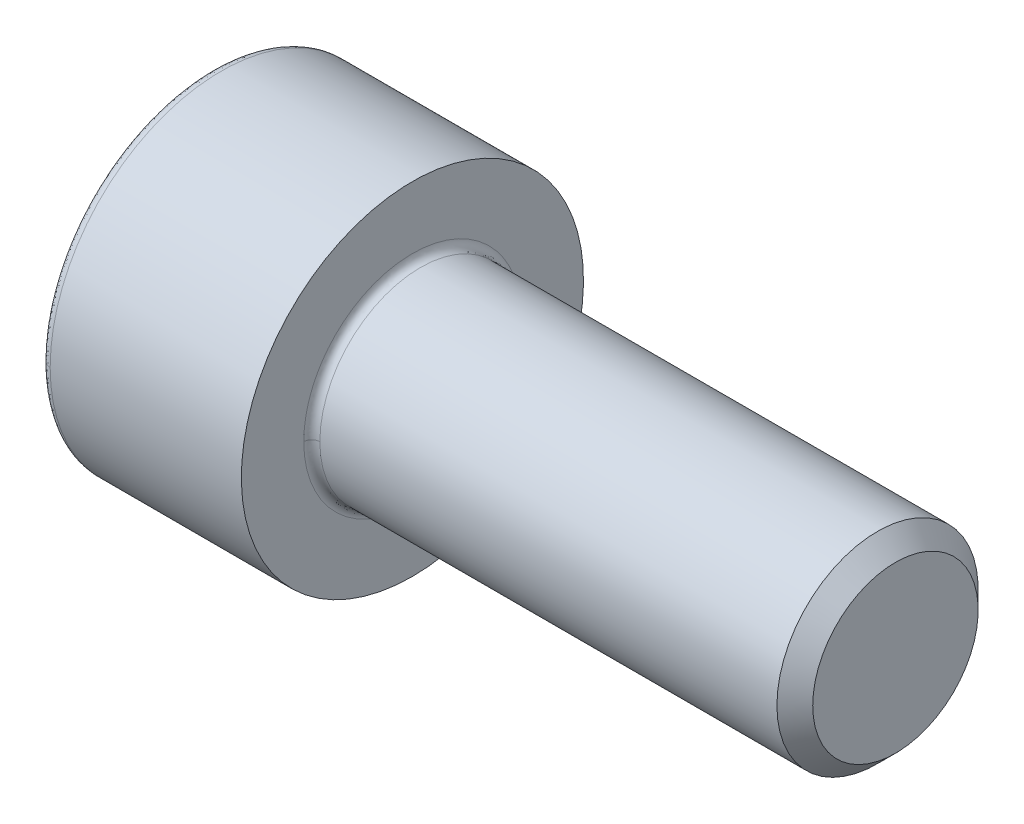
ISO-10303-21;
HEADER;
FILE_DESCRIPTION(('STEP AP214'),'2;1');
FILE_NAME('part.step','',(''),(''),'','','');
FILE_SCHEMA(('AUTOMOTIVE_DESIGN { 1 0 10303 214 1 1 1 1 }'));
ENDSEC;
DATA;
#1=APPLICATION_CONTEXT('core data for automotive mechanical design processes');
#2=APPLICATION_PROTOCOL_DEFINITION('international standard','automotive_design',2000,#1);
#3=PRODUCT_CONTEXT('',#1,'mechanical');
#4=PRODUCT('Part','Part','',(#3));
#5=PRODUCT_RELATED_PRODUCT_CATEGORY('part','',(#4));
#6=PRODUCT_DEFINITION_FORMATION('','',#4);
#7=PRODUCT_DEFINITION_CONTEXT('part definition',#1,'design');
#8=PRODUCT_DEFINITION('design','',#6,#7);
#9=PRODUCT_DEFINITION_SHAPE('','',#8);
#10=(LENGTH_UNIT() NAMED_UNIT(*) SI_UNIT(.MILLI.,.METRE.));
#11=(NAMED_UNIT(*) PLANE_ANGLE_UNIT() SI_UNIT($,.RADIAN.));
#12=(NAMED_UNIT(*) SI_UNIT($,.STERADIAN.) SOLID_ANGLE_UNIT());
#13=UNCERTAINTY_MEASURE_WITH_UNIT(LENGTH_MEASURE(1.E-05),#10,'distance_accuracy_value','');
#14=(GEOMETRIC_REPRESENTATION_CONTEXT(3) GLOBAL_UNCERTAINTY_ASSIGNED_CONTEXT((#13)) GLOBAL_UNIT_ASSIGNED_CONTEXT((#10,
#11,#12)) REPRESENTATION_CONTEXT('',''));
#15=CARTESIAN_POINT('',(0.,0.,0.));
#16=DIRECTION('',(0.,0.,1.));
#17=DIRECTION('',(1.,0.,0.));
#18=AXIS2_PLACEMENT_3D('',#15,#16,#17);
#19=CARTESIAN_POINT('',(17.,-2.07966,2.07966));
#20=DIRECTION('',(1.,0.,0.));
#21=DIRECTION('',(0.,0.,-1.));
#22=AXIS2_PLACEMENT_3D('',#19,#20,#21);
#23=PLANE('',#22);
#24=CARTESIAN_POINT('',(16.9999999999999,0.,0.));
#25=DIRECTION('',(-1.,0.,0.));
#26=DIRECTION('',(0.,0.,1.));
#27=AXIS2_PLACEMENT_3D('',#24,#25,#26);
#28=CIRCLE('',#27,2.0550000000001);
#29=CARTESIAN_POINT('',(16.9999999999999,0.,2.0550000000001));
#30=VERTEX_POINT('',#29);
#31=EDGE_CURVE('E20',#30,#30,#28,.F.);
#32=ORIENTED_EDGE('',*,*,#31,.T.);
#33=EDGE_LOOP('',(#32));
#34=FACE_BOUND('',#33,.T.);
#35=ADVANCED_FACE('F16',(#34),#23,.T.);
#36=CARTESIAN_POINT('',(17.,0.,0.));
#37=DIRECTION('',(-1.,0.,0.));
#38=DIRECTION('',(0.,0.,1.));
#39=AXIS2_PLACEMENT_3D('',#36,#37,#38);
#40=CONICAL_SURFACE('',#39,2.055,0.785398163397447);
#41=CARTESIAN_POINT('',(16.555,0.,0.));
#42=DIRECTION('',(-1.,0.,0.));
#43=DIRECTION('',(0.,0.,1.));
#44=AXIS2_PLACEMENT_3D('',#41,#42,#43);
#45=CIRCLE('',#44,2.5);
#46=CARTESIAN_POINT('',(16.555,0.,2.5));
#47=VERTEX_POINT('',#46);
#48=EDGE_CURVE('E350',#47,#47,#45,.F.);
#49=ORIENTED_EDGE('',*,*,#48,.T.);
#50=EDGE_LOOP('',(#49));
#51=FACE_BOUND('',#50,.T.);
#52=ORIENTED_EDGE('',*,*,#31,.F.);
#53=EDGE_LOOP('',(#52));
#54=FACE_BOUND('',#53,.T.);
#55=ADVANCED_FACE('F439',(#51,#54),#40,.T.);
#56=CARTESIAN_POINT('',(16.555,0.,0.));
#57=DIRECTION('',(-1.,0.,0.));
#58=DIRECTION('',(0.,0.,1.));
#59=AXIS2_PLACEMENT_3D('',#56,#57,#58);
#60=CYLINDRICAL_SURFACE('',#59,2.5);
#61=CARTESIAN_POINT('',(5.19999999962598,0.,0.));
#62=DIRECTION('',(1.,0.,0.));
#63=DIRECTION('',(0.,1.,0.));
#64=AXIS2_PLACEMENT_3D('',#61,#62,#63);
#65=CIRCLE('',#64,2.49999999998839);
#66=CARTESIAN_POINT('',(5.19999999962598,-2.56379285644164E-10,-2.4999999999913));
#67=VERTEX_POINT('',#66);
#68=CARTESIAN_POINT('',(5.19999999971949,0.,2.4999999999913));
#69=VERTEX_POINT('',#68);
#70=EDGE_CURVE('E353',#67,#69,#65,.T.);
#71=ORIENTED_EDGE('',*,*,#70,.T.);
#72=CARTESIAN_POINT('',(5.19999999962598,0.,0.));
#73=DIRECTION('',(1.,0.,0.));
#74=DIRECTION('',(0.,1.,0.));
#75=AXIS2_PLACEMENT_3D('',#72,#73,#74);
#76=CIRCLE('',#75,2.49999999998839);
#77=EDGE_CURVE('E342',#69,#67,#76,.T.);
#78=ORIENTED_EDGE('',*,*,#77,.T.);
#79=EDGE_LOOP('',(#71,#78));
#80=FACE_BOUND('',#79,.T.);
#81=ORIENTED_EDGE('',*,*,#48,.F.);
#82=EDGE_LOOP('',(#81));
#83=FACE_BOUND('',#82,.T.);
#84=ADVANCED_FACE('F327',(#80,#83),#60,.T.);
#85=CARTESIAN_POINT('',(5.000999167,0.,2.719966683));
#86=CARTESIAN_POINT('',(5.000999167,-5.439933367,2.719966683));
#87=CARTESIAN_POINT('',(5.000999167,-5.439933367,-2.719966683));
#88=CARTESIAN_POINT('',(5.000999167,0.,-2.719966683));
#89=CARTESIAN_POINT('',(4.987355915,0.,2.583989247));
#90=CARTESIAN_POINT('',(4.987355915,-5.167978494,2.583989247));
#91=CARTESIAN_POINT('',(4.987355915,-5.167978494,-2.583989247));
#92=CARTESIAN_POINT('',(4.987355915,0.,-2.583989247));
#93=CARTESIAN_POINT('',(5.083989247,0.,2.487355915));
#94=CARTESIAN_POINT('',(5.083989247,-4.974711831,2.487355915));
#95=CARTESIAN_POINT('',(5.083989247,-4.974711831,-2.487355915));
#96=CARTESIAN_POINT('',(5.083989247,0.,-2.487355915));
#97=CARTESIAN_POINT('',(5.219966683,0.,2.500999167));
#98=CARTESIAN_POINT('',(5.219966683,-5.001998334,2.500999167));
#99=CARTESIAN_POINT('',(5.219966683,-5.001998334,-2.500999167));
#100=CARTESIAN_POINT('',(5.219966683,0.,-2.500999167));
#101=(BOUNDED_SURFACE() B_SPLINE_SURFACE(3,3,((#85,#86,#87,#88),(#89,#90,#91,#92),(#93,#94,#95,
#96),(#97,#98,#99,#100)),.UNSPECIFIED.,.F.,.F.,.F.) B_SPLINE_SURFACE_WITH_KNOTS((4,4),(4,4),(0.,
1.),(0.,1.),.UNSPECIFIED.) GEOMETRIC_REPRESENTATION_ITEM() RATIONAL_B_SPLINE_SURFACE(((1.,
0.333333333333333,0.333333333333333,1.),(0.755320871117972,0.251773623705991,0.251773623705991,
0.755320871117972),(0.755320871117972,0.251773623705991,0.251773623705991,0.755320871117972),
(1.,0.333333333333333,0.333333333333333,1.))) REPRESENTATION_ITEM('') SURFACE());
#102=CARTESIAN_POINT('',(5.000999167,0.,2.719966683));
#103=CARTESIAN_POINT('',(4.987355915,0.,2.583989247));
#104=CARTESIAN_POINT('',(5.083989247,0.,2.487355915));
#105=CARTESIAN_POINT('',(5.219966683,0.,2.500999167));
#106=(BOUNDED_CURVE() B_SPLINE_CURVE(3,(#102,#103,#104,#105),.UNSPECIFIED.,.F.,
.F.) B_SPLINE_CURVE_WITH_KNOTS((4,4),(0.,1.),
.UNSPECIFIED.) CURVE() GEOMETRIC_REPRESENTATION_ITEM() RATIONAL_B_SPLINE_CURVE((1.,
0.755320871117972,0.755320871117972,1.)) REPRESENTATION_ITEM(''));
#107=CARTESIAN_POINT('',(4.99999999999304,0.,2.70000000000253));
#108=VERTEX_POINT('',#107);
#109=EDGE_CURVE('E302',#69,#108,#106,.F.);
#110=CARTESIAN_POINT('',(4.99999999998839,0.,2.69999999940735));
#111=CARTESIAN_POINT('',(4.99999999998839,-5.39999999968315,2.69999999940735));
#112=CARTESIAN_POINT('',(4.99999999998839,-5.39999999968315,-2.69999999940735));
#113=CARTESIAN_POINT('',(4.99999999998839,0.,-2.69999999940735));
#114=(BOUNDED_CURVE() B_SPLINE_CURVE(3,(#110,#111,#112,#113),.UNSPECIFIED.,.F.,
.F.) B_SPLINE_CURVE_WITH_KNOTS((4,4),(0.,1.),
.UNSPECIFIED.) CURVE() GEOMETRIC_REPRESENTATION_ITEM() RATIONAL_B_SPLINE_CURVE((0.956578301732848,
0.318859433910949,0.318859433910949,0.956578301732848)) REPRESENTATION_ITEM(''));
#115=CARTESIAN_POINT('',(4.99999999999304,0.,-2.70000000000254));
#116=VERTEX_POINT('',#115);
#117=EDGE_CURVE('E362',#116,#108,#114,.F.);
#118=CARTESIAN_POINT('',(5.000999167,0.,-2.719966683));
#119=CARTESIAN_POINT('',(4.987355915,0.,-2.583989247));
#120=CARTESIAN_POINT('',(5.083989247,0.,-2.487355915));
#121=CARTESIAN_POINT('',(5.219966683,0.,-2.500999167));
#122=(BOUNDED_CURVE() B_SPLINE_CURVE(3,(#118,#119,#120,#121),.UNSPECIFIED.,.F.,
.F.) B_SPLINE_CURVE_WITH_KNOTS((4,4),(0.,1.),
.UNSPECIFIED.) CURVE() GEOMETRIC_REPRESENTATION_ITEM() RATIONAL_B_SPLINE_CURVE((1.,
0.755320871117972,0.755320871117972,1.)) REPRESENTATION_ITEM(''));
#123=EDGE_CURVE('E349',#116,#67,#122,.T.);
#124=ORIENTED_EDGE('',*,*,#109,.T.);
#125=ORIENTED_EDGE('',*,*,#117,.F.);
#126=ORIENTED_EDGE('',*,*,#123,.T.);
#127=ORIENTED_EDGE('',*,*,#77,.F.);
#128=EDGE_LOOP('',(#124,#125,#126,#127));
#129=FACE_BOUND('',#128,.T.);
#130=ADVANCED_FACE('F316',(#129),#101,.F.);
#131=CARTESIAN_POINT('',(5.000999167,0.,-2.719966683));
#132=CARTESIAN_POINT('',(5.000999167,5.439933367,-2.719966683));
#133=CARTESIAN_POINT('',(5.000999167,5.439933367,2.719966683));
#134=CARTESIAN_POINT('',(5.000999167,0.,2.719966683));
#135=CARTESIAN_POINT('',(4.987355915,0.,-2.583989247));
#136=CARTESIAN_POINT('',(4.987355915,5.167978494,-2.583989247));
#137=CARTESIAN_POINT('',(4.987355915,5.167978494,2.583989247));
#138=CARTESIAN_POINT('',(4.987355915,0.,2.583989247));
#139=CARTESIAN_POINT('',(5.083989247,0.,-2.487355915));
#140=CARTESIAN_POINT('',(5.083989247,4.974711831,-2.487355915));
#141=CARTESIAN_POINT('',(5.083989247,4.974711831,2.487355915));
#142=CARTESIAN_POINT('',(5.083989247,0.,2.487355915));
#143=CARTESIAN_POINT('',(5.219966683,0.,-2.500999167));
#144=CARTESIAN_POINT('',(5.219966683,5.001998334,-2.500999167));
#145=CARTESIAN_POINT('',(5.219966683,5.001998334,2.500999167));
#146=CARTESIAN_POINT('',(5.219966683,0.,2.500999167));
#147=(BOUNDED_SURFACE() B_SPLINE_SURFACE(3,3,((#131,#132,#133,#134),(#135,#136,#137,#138),(#139,
#140,#141,#142),(#143,#144,#145,#146)),.UNSPECIFIED.,.F.,.F.,
.F.) B_SPLINE_SURFACE_WITH_KNOTS((4,4),(4,4),(0.,1.),(0.,1.),
.UNSPECIFIED.) GEOMETRIC_REPRESENTATION_ITEM() RATIONAL_B_SPLINE_SURFACE(((1.,0.333333333333333,
0.333333333333333,1.),(0.755320871117972,0.251773623705991,0.251773623705991,0.755320871117972),
(0.755320871117972,0.251773623705991,0.251773623705991,0.755320871117972),(1.,0.333333333333333,
0.333333333333333,1.))) REPRESENTATION_ITEM('') SURFACE());
#148=CARTESIAN_POINT('',(4.99999999998839,0.,-2.69999999940735));
#149=CARTESIAN_POINT('',(4.99999999998839,5.39999999968315,-2.69999999940735));
#150=CARTESIAN_POINT('',(4.99999999998839,5.39999999968315,2.69999999940735));
#151=CARTESIAN_POINT('',(4.99999999998839,0.,2.69999999940735));
#152=(BOUNDED_CURVE() B_SPLINE_CURVE(3,(#148,#149,#150,#151),.UNSPECIFIED.,.F.,
.F.) B_SPLINE_CURVE_WITH_KNOTS((4,4),(0.,1.),
.UNSPECIFIED.) CURVE() GEOMETRIC_REPRESENTATION_ITEM() RATIONAL_B_SPLINE_CURVE((0.956578301732847,
0.318859433910949,0.318859433910949,0.956578301732847)) REPRESENTATION_ITEM(''));
#153=EDGE_CURVE('E298',#108,#116,#152,.F.);
#154=ORIENTED_EDGE('',*,*,#70,.F.);
#155=ORIENTED_EDGE('',*,*,#123,.F.);
#156=ORIENTED_EDGE('',*,*,#153,.F.);
#157=ORIENTED_EDGE('',*,*,#109,.F.);
#158=EDGE_LOOP('',(#154,#155,#156,#157));
#159=FACE_BOUND('',#158,.T.);
#160=ADVANCED_FACE('F304',(#159),#147,.F.);
#161=CARTESIAN_POINT('',(5.,-4.301,4.301));
#162=DIRECTION('',(1.,0.,0.));
#163=DIRECTION('',(0.,0.,-1.));
#164=AXIS2_PLACEMENT_3D('',#161,#162,#163);
#165=PLANE('',#164);
#166=ORIENTED_EDGE('',*,*,#117,.T.);
#167=ORIENTED_EDGE('',*,*,#153,.T.);
#168=EDGE_LOOP('',(#166,#167));
#169=FACE_BOUND('',#168,.T.);
#170=CARTESIAN_POINT('',(5.,0.,0.));
#171=DIRECTION('',(-1.,0.,0.));
#172=DIRECTION('',(0.,-1.,0.));
#173=AXIS2_PLACEMENT_3D('',#170,#171,#172);
#174=CIRCLE('',#173,4.25);
#175=CARTESIAN_POINT('',(5.,-4.25,0.));
#176=VERTEX_POINT('',#175);
#177=EDGE_CURVE('E286',#176,#176,#174,.F.);
#178=ORIENTED_EDGE('',*,*,#177,.T.);
#179=EDGE_LOOP('',(#178));
#180=FACE_BOUND('',#179,.T.);
#181=ADVANCED_FACE('F315',(#169,#180),#165,.T.);
#182=CARTESIAN_POINT('',(5.,0.,0.));
#183=DIRECTION('',(-1.,0.,0.));
#184=DIRECTION('',(0.,-1.,0.));
#185=AXIS2_PLACEMENT_3D('',#182,#183,#184);
#186=CYLINDRICAL_SURFACE('',#185,4.25);
#187=ORIENTED_EDGE('',*,*,#177,.F.);
#188=EDGE_LOOP('',(#187));
#189=FACE_BOUND('',#188,.T.);
#190=CARTESIAN_POINT('',(0.249999999782476,0.,0.));
#191=DIRECTION('',(-1.,0.,0.));
#192=DIRECTION('',(0.,-1.,0.));
#193=AXIS2_PLACEMENT_3D('',#190,#191,#192);
#194=CIRCLE('',#193,4.24999999976451);
#195=CARTESIAN_POINT('',(0.249999999836857,-1.90811460411058E-10,4.24999999982338));
#196=VERTEX_POINT('',#195);
#197=CARTESIAN_POINT('',(0.249999999782476,-4.35844785595079E-10,-4.24999999982338));
#198=VERTEX_POINT('',#197);
#199=EDGE_CURVE('E283',#196,#198,#194,.T.);
#200=ORIENTED_EDGE('',*,*,#199,.F.);
#201=CARTESIAN_POINT('',(0.249999999782476,0.,0.));
#202=DIRECTION('',(-1.,0.,0.));
#203=DIRECTION('',(0.,-1.,0.));
#204=AXIS2_PLACEMENT_3D('',#201,#202,#203);
#205=CIRCLE('',#204,4.24999999976451);
#206=EDGE_CURVE('E289',#198,#196,#205,.T.);
#207=ORIENTED_EDGE('',*,*,#206,.F.);
#208=EDGE_LOOP('',(#200,#207));
#209=FACE_BOUND('',#208,.T.);
#210=ADVANCED_FACE('F230',(#189,#209),#186,.T.);
#211=CARTESIAN_POINT('',(0.001248959,0.,3.975041646));
#212=CARTESIAN_POINT('',(0.001248959,7.950083292,3.975041646));
#213=CARTESIAN_POINT('',(0.001248959,7.950083292,-3.975041646));
#214=CARTESIAN_POINT('',(0.001248959,0.,-3.975041646));
#215=CARTESIAN_POINT('',(-0.015805106,0.,4.145013441));
#216=CARTESIAN_POINT('',(-0.015805106,8.290026883,4.145013441));
#217=CARTESIAN_POINT('',(-0.015805106,8.290026883,-4.145013441));
#218=CARTESIAN_POINT('',(-0.015805106,0.,-4.145013441));
#219=CARTESIAN_POINT('',(0.104986559,0.,4.265805106));
#220=CARTESIAN_POINT('',(0.104986559,8.531610211,4.265805106));
#221=CARTESIAN_POINT('',(0.104986559,8.531610211,-4.265805106));
#222=CARTESIAN_POINT('',(0.104986559,0.,-4.265805106));
#223=CARTESIAN_POINT('',(0.274958354,0.,4.248751041));
#224=CARTESIAN_POINT('',(0.274958354,8.497502083,4.248751041));
#225=CARTESIAN_POINT('',(0.274958354,8.497502083,-4.248751041));
#226=CARTESIAN_POINT('',(0.274958354,0.,-4.248751041));
#227=(BOUNDED_SURFACE() B_SPLINE_SURFACE(3,3,((#211,#212,#213,#214),(#215,#216,#217,#218),(#219,
#220,#221,#222),(#223,#224,#225,#226)),.UNSPECIFIED.,.F.,.F.,
.F.) B_SPLINE_SURFACE_WITH_KNOTS((4,4),(4,4),(0.,1.),(0.,1.),
.UNSPECIFIED.) GEOMETRIC_REPRESENTATION_ITEM() RATIONAL_B_SPLINE_SURFACE(((1.,0.333333333333333,
0.333333333333333,1.),(0.755320871117972,0.251773623705991,0.251773623705991,0.755320871117972),
(0.755320871117972,0.251773623705991,0.251773623705991,0.755320871117972),(1.,0.333333333333333,
0.333333333333333,1.))) REPRESENTATION_ITEM('') SURFACE());
#228=CARTESIAN_POINT('',(2.3549224865202E-10,0.,-4.00000000018667));
#229=CARTESIAN_POINT('',(2.35492246282771E-10,8.00000000049604,-4.00000000018667));
#230=CARTESIAN_POINT('',(2.35492246282771E-10,8.00000000049604,4.00000000018667));
#231=CARTESIAN_POINT('',(2.3549224865202E-10,0.,4.00000000018667));
#232=(BOUNDED_CURVE() B_SPLINE_CURVE(3,(#228,#229,#230,#231),.UNSPECIFIED.,.F.,
.F.) B_SPLINE_CURVE_WITH_KNOTS((4,4),(0.,1.),
.UNSPECIFIED.) CURVE() GEOMETRIC_REPRESENTATION_ITEM() RATIONAL_B_SPLINE_CURVE((0.956578302214893,
0.318859434071631,0.318859434071631,0.956578302214893)) REPRESENTATION_ITEM(''));
#233=CARTESIAN_POINT('',(1.41295349308074E-10,0.,3.99999999932457));
#234=VERTEX_POINT('',#233);
#235=CARTESIAN_POINT('',(1.41295349308074E-10,0.,-3.99999999932457));
#236=VERTEX_POINT('',#235);
#237=EDGE_CURVE('E85',#234,#236,#232,.F.);
#238=CARTESIAN_POINT('',(0.001248959,0.,3.975041646));
#239=CARTESIAN_POINT('',(-0.015805106,0.,4.145013441));
#240=CARTESIAN_POINT('',(0.104986559,0.,4.265805106));
#241=CARTESIAN_POINT('',(0.274958354,0.,4.248751041));
#242=(BOUNDED_CURVE() B_SPLINE_CURVE(3,(#238,#239,#240,#241),.UNSPECIFIED.,.F.,
.F.) B_SPLINE_CURVE_WITH_KNOTS((4,4),(0.,1.),
.UNSPECIFIED.) CURVE() GEOMETRIC_REPRESENTATION_ITEM() RATIONAL_B_SPLINE_CURVE((1.,
0.755320871117972,0.755320871117972,1.)) REPRESENTATION_ITEM(''));
#243=EDGE_CURVE('E203',#196,#234,#242,.F.);
#244=CARTESIAN_POINT('',(0.001248959,0.,-3.975041646));
#245=CARTESIAN_POINT('',(-0.015805106,0.,-4.145013441));
#246=CARTESIAN_POINT('',(0.104986559,0.,-4.265805106));
#247=CARTESIAN_POINT('',(0.274958354,0.,-4.248751041));
#248=(BOUNDED_CURVE() B_SPLINE_CURVE(3,(#244,#245,#246,#247),.UNSPECIFIED.,.F.,
.F.) B_SPLINE_CURVE_WITH_KNOTS((4,4),(0.,1.),
.UNSPECIFIED.) CURVE() GEOMETRIC_REPRESENTATION_ITEM() RATIONAL_B_SPLINE_CURVE((1.,
0.755320871117972,0.755320871117972,1.)) REPRESENTATION_ITEM(''));
#249=EDGE_CURVE('E285',#236,#198,#248,.T.);
#250=ORIENTED_EDGE('',*,*,#237,.F.);
#251=ORIENTED_EDGE('',*,*,#243,.F.);
#252=ORIENTED_EDGE('',*,*,#199,.T.);
#253=ORIENTED_EDGE('',*,*,#249,.F.);
#254=EDGE_LOOP('',(#250,#251,#252,#253));
#255=FACE_BOUND('',#254,.T.);
#256=ADVANCED_FACE('F218',(#255),#227,.T.);
#257=CARTESIAN_POINT('',(0.001248959,0.,-3.975041646));
#258=CARTESIAN_POINT('',(0.001248959,-7.950083292,-3.975041646));
#259=CARTESIAN_POINT('',(0.001248959,-7.950083292,3.975041646));
#260=CARTESIAN_POINT('',(0.001248959,0.,3.975041646));
#261=CARTESIAN_POINT('',(-0.015805106,0.,-4.145013441));
#262=CARTESIAN_POINT('',(-0.015805106,-8.290026883,-4.145013441));
#263=CARTESIAN_POINT('',(-0.015805106,-8.290026883,4.145013441));
#264=CARTESIAN_POINT('',(-0.015805106,0.,4.145013441));
#265=CARTESIAN_POINT('',(0.104986559,0.,-4.265805106));
#266=CARTESIAN_POINT('',(0.104986559,-8.531610211,-4.265805106));
#267=CARTESIAN_POINT('',(0.104986559,-8.531610211,4.265805106));
#268=CARTESIAN_POINT('',(0.104986559,0.,4.265805106));
#269=CARTESIAN_POINT('',(0.274958354,0.,-4.248751041));
#270=CARTESIAN_POINT('',(0.274958354,-8.497502083,-4.248751041));
#271=CARTESIAN_POINT('',(0.274958354,-8.497502083,4.248751041));
#272=CARTESIAN_POINT('',(0.274958354,0.,4.248751041));
#273=(BOUNDED_SURFACE() B_SPLINE_SURFACE(3,3,((#257,#258,#259,#260),(#261,#262,#263,#264),(#265,
#266,#267,#268),(#269,#270,#271,#272)),.UNSPECIFIED.,.F.,.F.,
.F.) B_SPLINE_SURFACE_WITH_KNOTS((4,4),(4,4),(0.,1.),(0.,1.),
.UNSPECIFIED.) GEOMETRIC_REPRESENTATION_ITEM() RATIONAL_B_SPLINE_SURFACE(((1.,0.333333333333333,
0.333333333333333,1.),(0.755320871117972,0.251773623705991,0.251773623705991,0.755320871117972),
(0.755320871117972,0.251773623705991,0.251773623705991,0.755320871117972),(1.,0.333333333333333,
0.333333333333333,1.))) REPRESENTATION_ITEM('') SURFACE());
#274=CARTESIAN_POINT('',(2.35492249028318E-10,0.,4.00000000018667));
#275=CARTESIAN_POINT('',(2.35492246525386E-10,-8.00000000049603,4.00000000018667));
#276=CARTESIAN_POINT('',(2.35492246525386E-10,-8.00000000049603,-4.00000000018667));
#277=CARTESIAN_POINT('',(2.35492249028318E-10,0.,-4.00000000018667));
#278=(BOUNDED_CURVE() B_SPLINE_CURVE(3,(#274,#275,#276,#277),.UNSPECIFIED.,.F.,
.F.) B_SPLINE_CURVE_WITH_KNOTS((4,4),(0.,1.),
.UNSPECIFIED.) CURVE() GEOMETRIC_REPRESENTATION_ITEM() RATIONAL_B_SPLINE_CURVE((0.956578302214893,
0.318859434071631,0.318859434071631,0.956578302214893)) REPRESENTATION_ITEM(''));
#279=EDGE_CURVE('E198',#236,#234,#278,.F.);
#280=ORIENTED_EDGE('',*,*,#243,.T.);
#281=ORIENTED_EDGE('',*,*,#279,.F.);
#282=ORIENTED_EDGE('',*,*,#249,.T.);
#283=ORIENTED_EDGE('',*,*,#206,.T.);
#284=EDGE_LOOP('',(#280,#281,#282,#283));
#285=FACE_BOUND('',#284,.T.);
#286=ADVANCED_FACE('F205',(#285),#273,.T.);
#287=CARTESIAN_POINT('',(0.,1.17894925,2.042));
#288=DIRECTION('',(0.,-0.866025403910274,-0.499999999782046));
#289=DIRECTION('',(0.,0.499999999782046,-0.866025403910274));
#290=AXIS2_PLACEMENT_3D('',#287,#288,#289);
#291=PLANE('',#290);
#292=DIRECTION('',(0.,-0.499999999782046,0.866025403910274));
#293=VECTOR('',#292,1.);
#294=CARTESIAN_POINT('',(2.5,1.7684238745,1.021));
#295=LINE('',#294,#293);
#296=CARTESIAN_POINT('',(2.5,1.7684238745455,1.02099999994528));
#297=VERTEX_POINT('',#296);
#298=CARTESIAN_POINT('',(2.5,1.17894925,2.042));
#299=VERTEX_POINT('',#298);
#300=EDGE_CURVE('E264',#297,#299,#295,.T.);
#301=ORIENTED_EDGE('',*,*,#300,.T.);
#302=DIRECTION('',(-1.,0.,0.));
#303=VECTOR('',#302,1.);
#304=CARTESIAN_POINT('',(1.25,1.17894925,2.042));
#305=LINE('',#304,#303);
#306=CARTESIAN_POINT('',(0.,1.17894925081844,2.04199999943069));
#307=VERTEX_POINT('',#306);
#308=EDGE_CURVE('E183',#299,#307,#305,.T.);
#309=ORIENTED_EDGE('',*,*,#308,.T.);
#310=DIRECTION('',(0.,-0.500000000777957,0.866025403335285));
#311=VECTOR('',#310,1.);
#312=CARTESIAN_POINT('',(0.,2.357898502784,0.));
#313=LINE('',#312,#311);
#314=CARTESIAN_POINT('',(0.,2.3578985016015,-4.09630120622173E-10));
#315=VERTEX_POINT('',#314);
#316=EDGE_CURVE('E193',#315,#307,#313,.T.);
#317=ORIENTED_EDGE('',*,*,#316,.F.);
#318=DIRECTION('',(1.,0.,0.));
#319=VECTOR('',#318,1.);
#320=CARTESIAN_POINT('',(1.25,2.357898499,0.));
#321=LINE('',#320,#319);
#322=CARTESIAN_POINT('',(2.5,2.357898499,0.));
#323=VERTEX_POINT('',#322);
#324=EDGE_CURVE('E76',#315,#323,#321,.T.);
#325=ORIENTED_EDGE('',*,*,#324,.T.);
#326=DIRECTION('',(0.,-0.499999999782046,0.866025403910274));
#327=VECTOR('',#326,1.);
#328=CARTESIAN_POINT('',(2.5,1.7684238745,1.021));
#329=LINE('',#328,#327);
#330=EDGE_CURVE('E262',#323,#297,#329,.T.);
#331=ORIENTED_EDGE('',*,*,#330,.T.);
#332=EDGE_LOOP('',(#301,#309,#317,#325,#331));
#333=FACE_BOUND('',#332,.T.);
#334=ADVANCED_FACE('F217',(#333),#291,.T.);
#335=CARTESIAN_POINT('',(0.,1.17894925,2.042));
#336=DIRECTION('',(0.,0.,1.));
#337=DIRECTION('',(0.,-1.,0.));
#338=AXIS2_PLACEMENT_3D('',#335,#336,#337);
#339=PLANE('',#338);
#340=ORIENTED_EDGE('',*,*,#308,.F.);
#341=DIRECTION('',(0.,1.,0.));
#342=VECTOR('',#341,1.);
#343=CARTESIAN_POINT('',(2.5,0.,2.042));
#344=LINE('',#343,#342);
#345=CARTESIAN_POINT('',(2.5,-1.83358691000799E-10,2.042));
#346=VERTEX_POINT('',#345);
#347=EDGE_CURVE('E187',#346,#299,#344,.T.);
#348=ORIENTED_EDGE('',*,*,#347,.F.);
#349=DIRECTION('',(0.,1.,0.));
#350=VECTOR('',#349,1.);
#351=CARTESIAN_POINT('',(2.5,0.,2.042));
#352=LINE('',#351,#350);
#353=CARTESIAN_POINT('',(2.5,-1.17894925,2.042));
#354=VERTEX_POINT('',#353);
#355=EDGE_CURVE('E123',#354,#346,#352,.T.);
#356=ORIENTED_EDGE('',*,*,#355,.F.);
#357=DIRECTION('',(1.,0.,0.));
#358=VECTOR('',#357,1.);
#359=CARTESIAN_POINT('',(1.25,-1.17894925,2.042));
#360=LINE('',#359,#358);
#361=CARTESIAN_POINT('',(0.,-1.17894925081843,2.04199999943069));
#362=VERTEX_POINT('',#361);
#363=EDGE_CURVE('E186',#362,#354,#360,.T.);
#364=ORIENTED_EDGE('',*,*,#363,.F.);
#365=DIRECTION('',(0.,-1.,0.));
#366=VECTOR('',#365,1.);
#367=CARTESIAN_POINT('',(0.,0.,2.04199999872));
#368=LINE('',#367,#366);
#369=EDGE_CURVE('E190',#307,#362,#368,.T.);
#370=ORIENTED_EDGE('',*,*,#369,.F.);
#371=EDGE_LOOP('',(#340,#348,#356,#364,#370));
#372=FACE_BOUND('',#371,.T.);
#373=ADVANCED_FACE('F467',(#372),#339,.F.);
#374=CARTESIAN_POINT('',(0.,-2.357898499,0.));
#375=DIRECTION('',(0.,0.866025403910274,-0.499999999782046));
#376=DIRECTION('',(0.,0.499999999782046,0.866025403910274));
#377=AXIS2_PLACEMENT_3D('',#374,#375,#376);
#378=PLANE('',#377);
#379=DIRECTION('',(0.,-0.499999999782046,-0.866025403910274));
#380=VECTOR('',#379,1.);
#381=CARTESIAN_POINT('',(2.5,-1.7684238745,1.021));
#382=LINE('',#381,#380);
#383=CARTESIAN_POINT('',(2.5,-1.76842387463718,1.02099999978649));
#384=VERTEX_POINT('',#383);
#385=CARTESIAN_POINT('',(2.5,-2.357898499,0.));
#386=VERTEX_POINT('',#385);
#387=EDGE_CURVE('E180',#384,#386,#382,.T.);
#388=ORIENTED_EDGE('',*,*,#387,.T.);
#389=DIRECTION('',(1.,0.,0.));
#390=VECTOR('',#389,1.);
#391=CARTESIAN_POINT('',(1.25,-2.357898499,0.));
#392=LINE('',#391,#390);
#393=CARTESIAN_POINT('',(0.,-2.3578985016015,-4.09629923068786E-10));
#394=VERTEX_POINT('',#393);
#395=EDGE_CURVE('E173',#394,#386,#392,.T.);
#396=ORIENTED_EDGE('',*,*,#395,.F.);
#397=DIRECTION('',(0.,-0.500000000777958,-0.866025403335285));
#398=VECTOR('',#397,1.);
#399=CARTESIAN_POINT('',(0.,-1.178949251392,2.04199999872));
#400=LINE('',#399,#398);
#401=EDGE_CURVE('E192',#362,#394,#400,.T.);
#402=ORIENTED_EDGE('',*,*,#401,.F.);
#403=ORIENTED_EDGE('',*,*,#363,.T.);
#404=DIRECTION('',(0.,-0.499999999782046,-0.866025403910274));
#405=VECTOR('',#404,1.);
#406=CARTESIAN_POINT('',(2.5,-1.7684238745,1.021));
#407=LINE('',#406,#405);
#408=EDGE_CURVE('E115',#354,#384,#407,.T.);
#409=ORIENTED_EDGE('',*,*,#408,.T.);
#410=EDGE_LOOP('',(#388,#396,#402,#403,#409));
#411=FACE_BOUND('',#410,.T.);
#412=ADVANCED_FACE('F463',(#411),#378,.T.);
#413=CARTESIAN_POINT('',(0.,1.17894925,-2.042));
#414=DIRECTION('',(0.,0.866025403910274,-0.499999999782046));
#415=DIRECTION('',(0.,0.499999999782046,0.866025403910274));
#416=AXIS2_PLACEMENT_3D('',#413,#414,#415);
#417=PLANE('',#416);
#418=DIRECTION('',(1.,0.,0.));
#419=VECTOR('',#418,1.);
#420=CARTESIAN_POINT('',(1.25,1.17894925,-2.042));
#421=LINE('',#420,#419);
#422=CARTESIAN_POINT('',(0.,1.1789492503265,-2.042));
#423=VERTEX_POINT('',#422);
#424=CARTESIAN_POINT('',(2.5,1.17894924992382,-2.042));
#425=VERTEX_POINT('',#424);
#426=EDGE_CURVE('E154',#423,#425,#421,.T.);
#427=ORIENTED_EDGE('',*,*,#426,.T.);
#428=DIRECTION('',(0.,-0.499999999782046,-0.866025403910274));
#429=VECTOR('',#428,1.);
#430=CARTESIAN_POINT('',(2.5,1.7684238745,-1.021));
#431=LINE('',#430,#429);
#432=CARTESIAN_POINT('',(2.5,1.76842387471464,-1.02099999965233));
#433=VERTEX_POINT('',#432);
#434=EDGE_CURVE('E171',#433,#425,#431,.T.);
#435=ORIENTED_EDGE('',*,*,#434,.F.);
#436=DIRECTION('',(0.,-0.499999999782046,-0.866025403910274));
#437=VECTOR('',#436,1.);
#438=CARTESIAN_POINT('',(2.5,1.7684238745,-1.021));
#439=LINE('',#438,#437);
#440=EDGE_CURVE('E174',#323,#433,#439,.T.);
#441=ORIENTED_EDGE('',*,*,#440,.F.);
#442=ORIENTED_EDGE('',*,*,#324,.F.);
#443=DIRECTION('',(0.,0.500000000777957,0.866025403335285));
#444=VECTOR('',#443,1.);
#445=CARTESIAN_POINT('',(0.,1.178949251392,-2.04199999872));
#446=LINE('',#445,#444);
#447=EDGE_CURVE('E157',#423,#315,#446,.T.);
#448=ORIENTED_EDGE('',*,*,#447,.F.);
#449=EDGE_LOOP('',(#427,#435,#441,#442,#448));
#450=FACE_BOUND('',#449,.T.);
#451=ADVANCED_FACE('F477',(#450),#417,.F.);
#452=CARTESIAN_POINT('',(0.,-1.17894925,-2.042));
#453=DIRECTION('',(0.,0.866025403910274,0.499999999782046));
#454=DIRECTION('',(0.,-0.499999999782046,0.866025403910274));
#455=AXIS2_PLACEMENT_3D('',#452,#453,#454);
#456=PLANE('',#455);
#457=DIRECTION('',(0.,0.499999999782046,-0.866025403910274));
#458=VECTOR('',#457,1.);
#459=CARTESIAN_POINT('',(2.5,-1.7684238745,-1.021));
#460=LINE('',#459,#458);
#461=CARTESIAN_POINT('',(2.5,-1.76842387463196,-1.02099999977145));
#462=VERTEX_POINT('',#461);
#463=CARTESIAN_POINT('',(2.5,-1.17894924999048,-2.04200000001649));
#464=VERTEX_POINT('',#463);
#465=EDGE_CURVE('E135',#462,#464,#460,.T.);
#466=ORIENTED_EDGE('',*,*,#465,.T.);
#467=DIRECTION('',(-1.,0.,0.));
#468=VECTOR('',#467,1.);
#469=CARTESIAN_POINT('',(1.25,-1.17894925,-2.042));
#470=LINE('',#469,#468);
#471=CARTESIAN_POINT('',(0.,-1.1789492503265,-2.042));
#472=VERTEX_POINT('',#471);
#473=EDGE_CURVE('E138',#464,#472,#470,.T.);
#474=ORIENTED_EDGE('',*,*,#473,.T.);
#475=DIRECTION('',(0.,0.500000000777958,-0.866025403335285));
#476=VECTOR('',#475,1.);
#477=CARTESIAN_POINT('',(0.,-2.357898502784,0.));
#478=LINE('',#477,#476);
#479=EDGE_CURVE('E428',#394,#472,#478,.T.);
#480=ORIENTED_EDGE('',*,*,#479,.F.);
#481=ORIENTED_EDGE('',*,*,#395,.T.);
#482=DIRECTION('',(0.,0.499999999782046,-0.866025403910274));
#483=VECTOR('',#482,1.);
#484=CARTESIAN_POINT('',(2.5,-1.7684238745,-1.021));
#485=LINE('',#484,#483);
#486=EDGE_CURVE('E141',#386,#462,#485,.T.);
#487=ORIENTED_EDGE('',*,*,#486,.T.);
#488=EDGE_LOOP('',(#466,#474,#480,#481,#487));
#489=FACE_BOUND('',#488,.T.);
#490=ADVANCED_FACE('F136',(#489),#456,.T.);
#491=CARTESIAN_POINT('',(0.,-4.048,-4.048));
#492=DIRECTION('',(-1.,0.,0.));
#493=DIRECTION('',(0.,0.,1.));
#494=AXIS2_PLACEMENT_3D('',#491,#492,#493);
#495=PLANE('',#494);
#496=DIRECTION('',(0.,1.,0.));
#497=VECTOR('',#496,1.);
#498=CARTESIAN_POINT('',(0.,0.,-2.042));
#499=LINE('',#498,#497);
#500=EDGE_CURVE('E149',#472,#423,#499,.T.);
#501=ORIENTED_EDGE('',*,*,#500,.T.);
#502=ORIENTED_EDGE('',*,*,#447,.T.);
#503=ORIENTED_EDGE('',*,*,#316,.T.);
#504=ORIENTED_EDGE('',*,*,#369,.T.);
#505=ORIENTED_EDGE('',*,*,#401,.T.);
#506=ORIENTED_EDGE('',*,*,#479,.T.);
#507=EDGE_LOOP('',(#501,#502,#503,#504,#505,#506));
#508=FACE_BOUND('',#507,.T.);
#509=ORIENTED_EDGE('',*,*,#237,.T.);
#510=ORIENTED_EDGE('',*,*,#279,.T.);
#511=EDGE_LOOP('',(#509,#510));
#512=FACE_BOUND('',#511,.T.);
#513=ADVANCED_FACE('F393',(#508,#512),#495,.T.);
#514=CARTESIAN_POINT('',(0.,-1.17894925,-2.042));
#515=DIRECTION('',(0.,0.,-1.));
#516=DIRECTION('',(0.,1.,0.));
#517=AXIS2_PLACEMENT_3D('',#514,#515,#516);
#518=PLANE('',#517);
#519=ORIENTED_EDGE('',*,*,#473,.F.);
#520=DIRECTION('',(0.,-1.,0.));
#521=VECTOR('',#520,1.);
#522=CARTESIAN_POINT('',(2.5,0.,-2.042));
#523=LINE('',#522,#521);
#524=CARTESIAN_POINT('',(2.5,-4.188212414687E-10,-2.042));
#525=VERTEX_POINT('',#524);
#526=EDGE_CURVE('E35',#525,#464,#523,.T.);
#527=ORIENTED_EDGE('',*,*,#526,.F.);
#528=DIRECTION('',(0.,-1.,0.));
#529=VECTOR('',#528,1.);
#530=CARTESIAN_POINT('',(2.5,0.8842119375,-2.042));
#531=LINE('',#530,#529);
#532=EDGE_CURVE('E178',#425,#525,#531,.T.);
#533=ORIENTED_EDGE('',*,*,#532,.F.);
#534=ORIENTED_EDGE('',*,*,#426,.F.);
#535=ORIENTED_EDGE('',*,*,#500,.F.);
#536=EDGE_LOOP('',(#519,#527,#533,#534,#535));
#537=FACE_BOUND('',#536,.T.);
#538=ADVANCED_FACE('F147',(#537),#518,.F.);
#539=CARTESIAN_POINT('',(2.5,-0.010610543,1.014874));
#540=DIRECTION('',(-1.,0.,0.));
#541=DIRECTION('',(0.,0.,1.));
#542=AXIS2_PLACEMENT_3D('',#539,#540,#541);
#543=PLANE('',#542);
#544=ORIENTED_EDGE('',*,*,#347,.T.);
#545=ORIENTED_EDGE('',*,*,#300,.F.);
#546=CARTESIAN_POINT('',(2.5,0.,0.));
#547=DIRECTION('',(-1.,0.,0.));
#548=DIRECTION('',(0.,-1.,0.));
#549=AXIS2_PLACEMENT_3D('',#546,#547,#548);
#550=CIRCLE('',#549,2.042);
#551=EDGE_CURVE('E424',#346,#297,#550,.T.);
#552=ORIENTED_EDGE('',*,*,#551,.F.);
#553=EDGE_LOOP('',(#544,#545,#552));
#554=FACE_BOUND('',#553,.T.);
#555=ADVANCED_FACE('F472',(#554),#543,.T.);
#556=CARTESIAN_POINT('',(2.5,1.764887027,-1.033252));
#557=DIRECTION('',(-1.,0.,0.));
#558=DIRECTION('',(0.,0.,1.));
#559=AXIS2_PLACEMENT_3D('',#556,#557,#558);
#560=PLANE('',#559);
#561=ORIENTED_EDGE('',*,*,#330,.F.);
#562=ORIENTED_EDGE('',*,*,#440,.T.);
#563=CARTESIAN_POINT('',(2.5,0.,0.));
#564=DIRECTION('',(-1.,0.,0.));
#565=DIRECTION('',(0.,-1.,0.));
#566=AXIS2_PLACEMENT_3D('',#563,#564,#565);
#567=CIRCLE('',#566,2.042);
#568=EDGE_CURVE('E421',#297,#433,#567,.T.);
#569=ORIENTED_EDGE('',*,*,#568,.F.);
#570=EDGE_LOOP('',(#561,#562,#569));
#571=FACE_BOUND('',#570,.T.);
#572=ADVANCED_FACE('F476',(#571),#560,.T.);
#573=CARTESIAN_POINT('',(2.5,-0.010610543,-2.042));
#574=DIRECTION('',(-1.,0.,0.));
#575=DIRECTION('',(0.,0.,1.));
#576=AXIS2_PLACEMENT_3D('',#573,#574,#575);
#577=PLANE('',#576);
#578=ORIENTED_EDGE('',*,*,#434,.T.);
#579=ORIENTED_EDGE('',*,*,#532,.T.);
#580=CARTESIAN_POINT('',(2.5,0.,0.));
#581=DIRECTION('',(-1.,0.,0.));
#582=DIRECTION('',(0.,-1.,0.));
#583=AXIS2_PLACEMENT_3D('',#580,#581,#582);
#584=CIRCLE('',#583,2.042);
#585=EDGE_CURVE('E418',#433,#525,#584,.T.);
#586=ORIENTED_EDGE('',*,*,#585,.F.);
#587=EDGE_LOOP('',(#578,#579,#586));
#588=FACE_BOUND('',#587,.T.);
#589=ADVANCED_FACE('F479',(#588),#577,.T.);
#590=CARTESIAN_POINT('',(2.5,-1.779034418,-2.042));
#591=DIRECTION('',(-1.,0.,0.));
#592=DIRECTION('',(0.,0.,1.));
#593=AXIS2_PLACEMENT_3D('',#590,#591,#592);
#594=PLANE('',#593);
#595=ORIENTED_EDGE('',*,*,#526,.T.);
#596=ORIENTED_EDGE('',*,*,#465,.F.);
#597=CARTESIAN_POINT('',(2.5,0.,0.));
#598=DIRECTION('',(-1.,0.,0.));
#599=DIRECTION('',(0.,-1.,0.));
#600=AXIS2_PLACEMENT_3D('',#597,#598,#599);
#601=CIRCLE('',#600,2.042);
#602=EDGE_CURVE('E153',#525,#462,#601,.T.);
#603=ORIENTED_EDGE('',*,*,#602,.F.);
#604=EDGE_LOOP('',(#595,#596,#603));
#605=FACE_BOUND('',#604,.T.);
#606=ADVANCED_FACE('F151',(#605),#594,.T.);
#607=CARTESIAN_POINT('',(2.5,-2.361435347,-1.033252));
#608=DIRECTION('',(-1.,0.,0.));
#609=DIRECTION('',(0.,0.,1.));
#610=AXIS2_PLACEMENT_3D('',#607,#608,#609);
#611=PLANE('',#610);
#612=ORIENTED_EDGE('',*,*,#486,.F.);
#613=ORIENTED_EDGE('',*,*,#387,.F.);
#614=CARTESIAN_POINT('',(2.5,0.,0.));
#615=DIRECTION('',(-1.,0.,0.));
#616=DIRECTION('',(0.,-1.,0.));
#617=AXIS2_PLACEMENT_3D('',#614,#615,#616);
#618=CIRCLE('',#617,2.042);
#619=EDGE_CURVE('E26',#462,#384,#618,.T.);
#620=ORIENTED_EDGE('',*,*,#619,.F.);
#621=EDGE_LOOP('',(#612,#613,#620));
#622=FACE_BOUND('',#621,.T.);
#623=ADVANCED_FACE('F456',(#622),#611,.T.);
#624=CARTESIAN_POINT('',(2.5,-1.779034418,1.014874));
#625=DIRECTION('',(-1.,0.,0.));
#626=DIRECTION('',(0.,0.,1.));
#627=AXIS2_PLACEMENT_3D('',#624,#625,#626);
#628=PLANE('',#627);
#629=ORIENTED_EDGE('',*,*,#408,.F.);
#630=ORIENTED_EDGE('',*,*,#355,.T.);
#631=CARTESIAN_POINT('',(2.5,0.,0.));
#632=DIRECTION('',(-1.,0.,0.));
#633=DIRECTION('',(0.,-1.,0.));
#634=AXIS2_PLACEMENT_3D('',#631,#632,#633);
#635=CIRCLE('',#634,2.042);
#636=EDGE_CURVE('E11',#384,#346,#635,.T.);
#637=ORIENTED_EDGE('',*,*,#636,.F.);
#638=EDGE_LOOP('',(#629,#630,#637));
#639=FACE_BOUND('',#638,.T.);
#640=ADVANCED_FACE('F18',(#639),#628,.T.);
#641=CARTESIAN_POINT('',(3.67894925,0.,0.));
#642=DIRECTION('',(-1.,0.,0.));
#643=DIRECTION('',(0.,-1.,0.));
#644=AXIS2_PLACEMENT_3D('',#641,#642,#643);
#645=CONICAL_SURFACE('',#644,0.,1.04719755108098);
#646=CARTESIAN_POINT('',(3.67894925,0.,0.));
#647=VERTEX_POINT('',#646);
#648=VERTEX_LOOP('',#647);
#649=FACE_BOUND('',#648,.T.);
#650=ORIENTED_EDGE('',*,*,#619,.T.);
#651=ORIENTED_EDGE('',*,*,#636,.T.);
#652=ORIENTED_EDGE('',*,*,#551,.T.);
#653=ORIENTED_EDGE('',*,*,#568,.T.);
#654=ORIENTED_EDGE('',*,*,#585,.T.);
#655=ORIENTED_EDGE('',*,*,#602,.T.);
#656=EDGE_LOOP('',(#650,#651,#652,#653,#654,#655));
#657=FACE_BOUND('',#656,.T.);
#658=ADVANCED_FACE('F219',(#649,#657),#645,.F.);
#659=CLOSED_SHELL('',(#35,#55,#84,#130,#160,#181,#210,#256,#286,#334,#373,#412,#451,#490,#513,
#538,#555,#572,#589,#606,#623,#640,#658));
#660=MANIFOLD_SOLID_BREP('B1',#659);
#661=ADVANCED_BREP_SHAPE_REPRESENTATION('',(#18,#660),#14);
#662=SHAPE_DEFINITION_REPRESENTATION(#9,#661);
ENDSEC;
END-ISO-10303-21;
